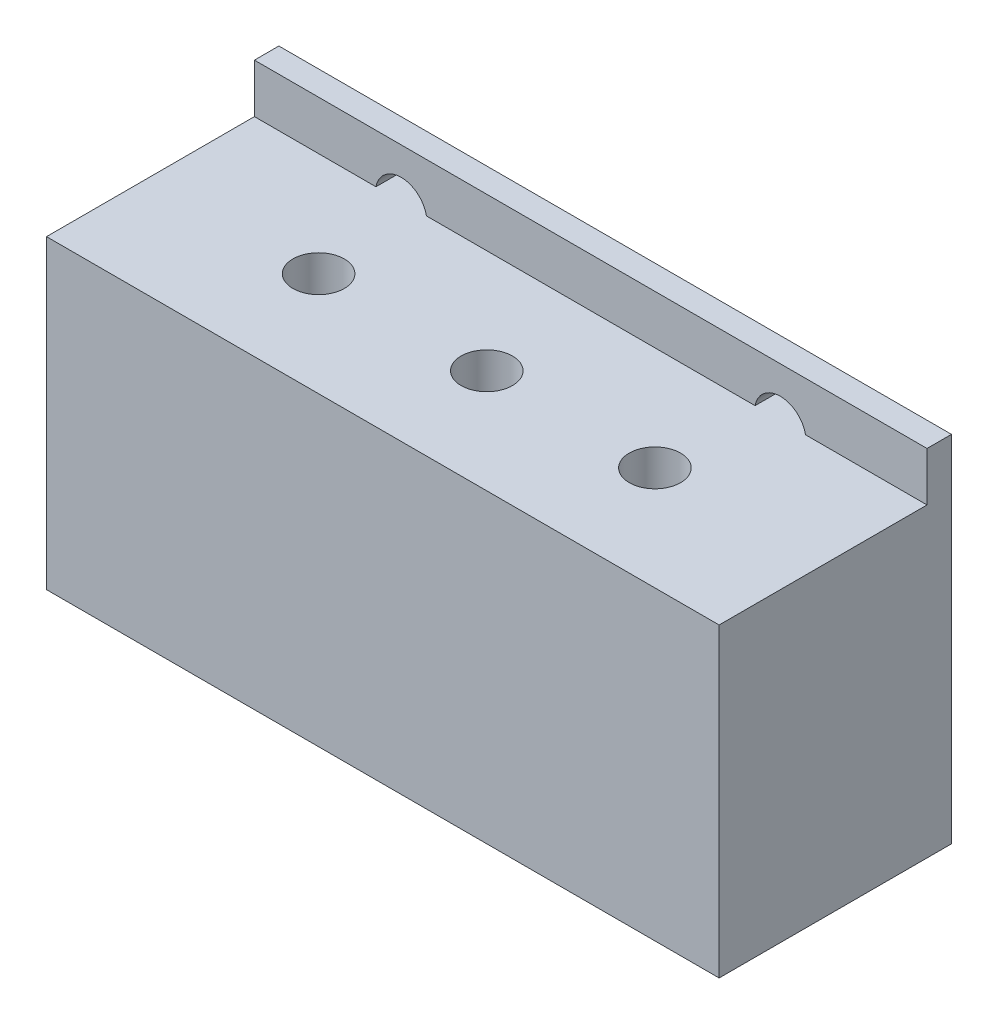
ISO-10303-21;
HEADER;
FILE_DESCRIPTION(('STEP AP214'),'2;1');
FILE_NAME('part.step','',(''),(''),'','','');
FILE_SCHEMA(('AUTOMOTIVE_DESIGN { 1 0 10303 214 1 1 1 1 }'));
ENDSEC;
DATA;
#1=APPLICATION_CONTEXT('core data for automotive mechanical design processes');
#2=APPLICATION_PROTOCOL_DEFINITION('international standard','automotive_design',2000,#1);
#3=PRODUCT_CONTEXT('',#1,'mechanical');
#4=PRODUCT('Part','Part','',(#3));
#5=PRODUCT_RELATED_PRODUCT_CATEGORY('part','',(#4));
#6=PRODUCT_DEFINITION_FORMATION('','',#4);
#7=PRODUCT_DEFINITION_CONTEXT('part definition',#1,'design');
#8=PRODUCT_DEFINITION('design','',#6,#7);
#9=PRODUCT_DEFINITION_SHAPE('','',#8);
#10=(LENGTH_UNIT() NAMED_UNIT(*) SI_UNIT(.MILLI.,.METRE.));
#11=(NAMED_UNIT(*) PLANE_ANGLE_UNIT() SI_UNIT($,.RADIAN.));
#12=(NAMED_UNIT(*) SI_UNIT($,.STERADIAN.) SOLID_ANGLE_UNIT());
#13=UNCERTAINTY_MEASURE_WITH_UNIT(LENGTH_MEASURE(1.E-05),#10,'distance_accuracy_value','');
#14=(GEOMETRIC_REPRESENTATION_CONTEXT(3) GLOBAL_UNCERTAINTY_ASSIGNED_CONTEXT((#13)) GLOBAL_UNIT_ASSIGNED_CONTEXT((#10,
#11,#12)) REPRESENTATION_CONTEXT('',''));
#15=CARTESIAN_POINT('',(0.,0.,0.));
#16=DIRECTION('',(0.,0.,1.));
#17=DIRECTION('',(1.,0.,0.));
#18=AXIS2_PLACEMENT_3D('',#15,#16,#17);
#19=CARTESIAN_POINT('',(0.,0.,10.));
#20=DIRECTION('',(0.,0.,-1.));
#21=DIRECTION('',(-1.,0.,0.));
#22=AXIS2_PLACEMENT_3D('',#19,#20,#21);
#23=PLANE('',#22);
#24=DIRECTION('',(-1.,0.,0.));
#25=VECTOR('',#24,1.);
#26=CARTESIAN_POINT('',(0.,125.,10.));
#27=LINE('',#26,#25);
#28=CARTESIAN_POINT('',(275.,125.,10.));
#29=VERTEX_POINT('',#28);
#30=CARTESIAN_POINT('',(225.307764064044,125.,10.));
#31=VERTEX_POINT('',#30);
#32=EDGE_CURVE('E48',#29,#31,#27,.T.);
#33=ORIENTED_EDGE('',*,*,#32,.F.);
#34=DIRECTION('',(0.,1.,0.));
#35=VECTOR('',#34,1.);
#36=CARTESIAN_POINT('',(275.,0.,10.));
#37=LINE('',#36,#35);
#38=CARTESIAN_POINT('',(275.,145.,10.));
#39=VERTEX_POINT('',#38);
#40=EDGE_CURVE('E140',#29,#39,#37,.T.);
#41=ORIENTED_EDGE('',*,*,#40,.T.);
#42=DIRECTION('',(-1.,0.,0.));
#43=VECTOR('',#42,1.);
#44=CARTESIAN_POINT('',(0.,145.,10.));
#45=LINE('',#44,#43);
#46=CARTESIAN_POINT('',(0.,145.,10.));
#47=VERTEX_POINT('',#46);
#48=EDGE_CURVE('E57',#39,#47,#45,.T.);
#49=ORIENTED_EDGE('',*,*,#48,.T.);
#50=DIRECTION('',(0.,-1.,0.));
#51=VECTOR('',#50,1.);
#52=CARTESIAN_POINT('',(0.,0.,10.));
#53=LINE('',#52,#51);
#54=CARTESIAN_POINT('',(0.,125.,10.));
#55=VERTEX_POINT('',#54);
#56=EDGE_CURVE('E86',#47,#55,#53,.T.);
#57=ORIENTED_EDGE('',*,*,#56,.T.);
#58=CARTESIAN_POINT('',(49.6922359359558,125.,10.));
#59=VERTEX_POINT('',#58);
#60=EDGE_CURVE('E134',#59,#55,#27,.T.);
#61=ORIENTED_EDGE('',*,*,#60,.F.);
#62=CARTESIAN_POINT('',(60.,123.,10.));
#63=DIRECTION('',(0.,0.,1.));
#64=DIRECTION('',(1.,0.,0.));
#65=AXIS2_PLACEMENT_3D('',#62,#63,#64);
#66=CIRCLE('',#65,10.5);
#67=CARTESIAN_POINT('',(70.3077640640442,125.,10.));
#68=VERTEX_POINT('',#67);
#69=EDGE_CURVE('E98',#68,#59,#66,.T.);
#70=ORIENTED_EDGE('',*,*,#69,.F.);
#71=CARTESIAN_POINT('',(204.692235935956,125.,10.));
#72=VERTEX_POINT('',#71);
#73=EDGE_CURVE('E130',#72,#68,#27,.T.);
#74=ORIENTED_EDGE('',*,*,#73,.F.);
#75=CARTESIAN_POINT('',(215.,123.,10.));
#76=DIRECTION('',(0.,0.,1.));
#77=DIRECTION('',(-1.,0.,0.));
#78=AXIS2_PLACEMENT_3D('',#75,#76,#77);
#79=CIRCLE('',#78,10.5);
#80=EDGE_CURVE('E119',#31,#72,#79,.T.);
#81=ORIENTED_EDGE('',*,*,#80,.F.);
#82=EDGE_LOOP('',(#33,#41,#49,#57,#61,#70,#74,#81));
#83=FACE_BOUND('',#82,.T.);
#84=ADVANCED_FACE('F33',(#83),#23,.F.);
#85=CARTESIAN_POINT('',(60.,123.,10.));
#86=DIRECTION('',(0.,0.,-1.));
#87=DIRECTION('',(-1.,0.,0.));
#88=AXIS2_PLACEMENT_3D('',#85,#86,#87);
#89=CYLINDRICAL_SURFACE('',#88,10.5);
#90=ORIENTED_EDGE('',*,*,#69,.T.);
#91=DIRECTION('',(0.,0.,-1.));
#92=VECTOR('',#91,1.);
#93=CARTESIAN_POINT('',(49.6922359359558,125.,10.));
#94=LINE('',#93,#92);
#95=CARTESIAN_POINT('',(49.6922359359558,125.,0.));
#96=VERTEX_POINT('',#95);
#97=EDGE_CURVE('E137',#59,#96,#94,.T.);
#98=ORIENTED_EDGE('',*,*,#97,.T.);
#99=CARTESIAN_POINT('',(60.,123.,0.));
#100=DIRECTION('',(0.,0.,1.));
#101=DIRECTION('',(1.,0.,0.));
#102=AXIS2_PLACEMENT_3D('',#99,#100,#101);
#103=CIRCLE('',#102,10.5);
#104=CARTESIAN_POINT('',(70.3077640640442,125.,0.));
#105=VERTEX_POINT('',#104);
#106=EDGE_CURVE('E102',#105,#96,#103,.T.);
#107=ORIENTED_EDGE('',*,*,#106,.F.);
#108=DIRECTION('',(0.,0.,-1.));
#109=VECTOR('',#108,1.);
#110=CARTESIAN_POINT('',(70.3077640640442,125.,10.));
#111=LINE('',#110,#109);
#112=EDGE_CURVE('E178',#105,#68,#111,.F.);
#113=ORIENTED_EDGE('',*,*,#112,.T.);
#114=EDGE_LOOP('',(#90,#98,#107,#113));
#115=FACE_BOUND('',#114,.T.);
#116=ADVANCED_FACE('F236',(#115),#89,.F.);
#117=CARTESIAN_POINT('',(215.,123.,10.));
#118=DIRECTION('',(0.,0.,-1.));
#119=DIRECTION('',(-1.,0.,0.));
#120=AXIS2_PLACEMENT_3D('',#117,#118,#119);
#121=CYLINDRICAL_SURFACE('',#120,10.5);
#122=ORIENTED_EDGE('',*,*,#80,.T.);
#123=DIRECTION('',(0.,0.,-1.));
#124=VECTOR('',#123,1.);
#125=CARTESIAN_POINT('',(204.692235935956,125.,10.));
#126=LINE('',#125,#124);
#127=CARTESIAN_POINT('',(204.692235935956,125.,0.));
#128=VERTEX_POINT('',#127);
#129=EDGE_CURVE('E11',#72,#128,#126,.T.);
#130=ORIENTED_EDGE('',*,*,#129,.T.);
#131=CARTESIAN_POINT('',(215.,123.,0.));
#132=DIRECTION('',(0.,0.,1.));
#133=DIRECTION('',(-1.,0.,0.));
#134=AXIS2_PLACEMENT_3D('',#131,#132,#133);
#135=CIRCLE('',#134,10.5);
#136=CARTESIAN_POINT('',(225.307764064044,125.,0.));
#137=VERTEX_POINT('',#136);
#138=EDGE_CURVE('E122',#137,#128,#135,.T.);
#139=ORIENTED_EDGE('',*,*,#138,.F.);
#140=DIRECTION('',(0.,0.,-1.));
#141=VECTOR('',#140,1.);
#142=CARTESIAN_POINT('',(225.307764064044,125.,10.));
#143=LINE('',#142,#141);
#144=EDGE_CURVE('E41',#137,#31,#143,.F.);
#145=ORIENTED_EDGE('',*,*,#144,.T.);
#146=EDGE_LOOP('',(#122,#130,#139,#145));
#147=FACE_BOUND('',#146,.T.);
#148=ADVANCED_FACE('F117',(#147),#121,.F.);
#149=CARTESIAN_POINT('',(0.,0.,0.));
#150=DIRECTION('',(0.,0.,-1.));
#151=DIRECTION('',(-1.,0.,0.));
#152=AXIS2_PLACEMENT_3D('',#149,#150,#151);
#153=PLANE('',#152);
#154=DIRECTION('',(-1.,0.,0.));
#155=VECTOR('',#154,1.);
#156=CARTESIAN_POINT('',(275.,125.,0.));
#157=LINE('',#156,#155);
#158=EDGE_CURVE('E197',#137,#128,#157,.T.);
#159=ORIENTED_EDGE('',*,*,#158,.F.);
#160=ORIENTED_EDGE('',*,*,#138,.T.);
#161=EDGE_LOOP('',(#159,#160));
#162=FACE_BOUND('',#161,.T.);
#163=EDGE_CURVE('E167',#105,#96,#157,.T.);
#164=ORIENTED_EDGE('',*,*,#163,.F.);
#165=ORIENTED_EDGE('',*,*,#106,.T.);
#166=EDGE_LOOP('',(#164,#165));
#167=FACE_BOUND('',#166,.T.);
#168=DIRECTION('',(-1.,0.,0.));
#169=VECTOR('',#168,1.);
#170=CARTESIAN_POINT('',(0.,145.,0.));
#171=LINE('',#170,#169);
#172=CARTESIAN_POINT('',(275.,145.,0.));
#173=VERTEX_POINT('',#172);
#174=CARTESIAN_POINT('',(0.,145.,0.));
#175=VERTEX_POINT('',#174);
#176=EDGE_CURVE('E76',#173,#175,#171,.T.);
#177=ORIENTED_EDGE('',*,*,#176,.F.);
#178=DIRECTION('',(0.,1.,0.));
#179=VECTOR('',#178,1.);
#180=CARTESIAN_POINT('',(275.,0.,0.));
#181=LINE('',#180,#179);
#182=CARTESIAN_POINT('',(275.,0.,0.));
#183=VERTEX_POINT('',#182);
#184=EDGE_CURVE('E87',#183,#173,#181,.T.);
#185=ORIENTED_EDGE('',*,*,#184,.F.);
#186=DIRECTION('',(1.,0.,0.));
#187=VECTOR('',#186,1.);
#188=CARTESIAN_POINT('',(0.,0.,0.));
#189=LINE('',#188,#187);
#190=CARTESIAN_POINT('',(0.,0.,0.));
#191=VERTEX_POINT('',#190);
#192=EDGE_CURVE('E96',#191,#183,#189,.T.);
#193=ORIENTED_EDGE('',*,*,#192,.F.);
#194=DIRECTION('',(0.,-1.,0.));
#195=VECTOR('',#194,1.);
#196=CARTESIAN_POINT('',(0.,0.,0.));
#197=LINE('',#196,#195);
#198=EDGE_CURVE('E91',#175,#191,#197,.T.);
#199=ORIENTED_EDGE('',*,*,#198,.F.);
#200=EDGE_LOOP('',(#177,#185,#193,#199));
#201=FACE_BOUND('',#200,.T.);
#202=ADVANCED_FACE('F95',(#162,#167,#201),#153,.T.);
#203=CARTESIAN_POINT('',(0.,0.,10.));
#204=DIRECTION('',(1.,0.,0.));
#205=DIRECTION('',(0.,0.,-1.));
#206=AXIS2_PLACEMENT_3D('',#203,#204,#205);
#207=PLANE('',#206);
#208=DIRECTION('',(0.,0.,-1.));
#209=VECTOR('',#208,1.);
#210=CARTESIAN_POINT('',(0.,0.,10.));
#211=LINE('',#210,#209);
#212=CARTESIAN_POINT('',(0.,0.,95.));
#213=VERTEX_POINT('',#212);
#214=EDGE_CURVE('E112',#213,#191,#211,.T.);
#215=ORIENTED_EDGE('',*,*,#214,.F.);
#216=DIRECTION('',(0.,-1.,0.));
#217=VECTOR('',#216,1.);
#218=CARTESIAN_POINT('',(0.,125.,95.));
#219=LINE('',#218,#217);
#220=CARTESIAN_POINT('',(0.,125.,95.));
#221=VERTEX_POINT('',#220);
#222=EDGE_CURVE('E163',#221,#213,#219,.T.);
#223=ORIENTED_EDGE('',*,*,#222,.F.);
#224=DIRECTION('',(0.,0.,1.));
#225=VECTOR('',#224,1.);
#226=CARTESIAN_POINT('',(0.,125.,0.));
#227=LINE('',#226,#225);
#228=EDGE_CURVE('E193',#55,#221,#227,.T.);
#229=ORIENTED_EDGE('',*,*,#228,.F.);
#230=ORIENTED_EDGE('',*,*,#56,.F.);
#231=DIRECTION('',(0.,0.,-1.));
#232=VECTOR('',#231,1.);
#233=CARTESIAN_POINT('',(0.,145.,10.));
#234=LINE('',#233,#232);
#235=EDGE_CURVE('E79',#47,#175,#234,.T.);
#236=ORIENTED_EDGE('',*,*,#235,.T.);
#237=ORIENTED_EDGE('',*,*,#198,.T.);
#238=EDGE_LOOP('',(#215,#223,#229,#230,#236,#237));
#239=FACE_BOUND('',#238,.T.);
#240=ADVANCED_FACE('F35',(#239),#207,.F.);
#241=CARTESIAN_POINT('',(0.,0.,10.));
#242=DIRECTION('',(0.,1.,0.));
#243=DIRECTION('',(0.,0.,1.));
#244=AXIS2_PLACEMENT_3D('',#241,#242,#243);
#245=PLANE('',#244);
#246=CARTESIAN_POINT('',(206.25,0.,52.5));
#247=DIRECTION('',(0.,1.,0.));
#248=DIRECTION('',(0.,0.,1.));
#249=AXIS2_PLACEMENT_3D('',#246,#247,#248);
#250=CIRCLE('',#249,10.5);
#251=CARTESIAN_POINT('',(206.25,0.,63.));
#252=VERTEX_POINT('',#251);
#253=EDGE_CURVE('E165',#252,#252,#250,.T.);
#254=ORIENTED_EDGE('',*,*,#253,.T.);
#255=EDGE_LOOP('',(#254));
#256=FACE_BOUND('',#255,.T.);
#257=CARTESIAN_POINT('',(137.5,0.,52.5000000000005));
#258=DIRECTION('',(0.,1.,0.));
#259=DIRECTION('',(0.,0.,1.));
#260=AXIS2_PLACEMENT_3D('',#257,#258,#259);
#261=CIRCLE('',#260,10.5);
#262=CARTESIAN_POINT('',(137.5,0.,63.0000000000005));
#263=VERTEX_POINT('',#262);
#264=EDGE_CURVE('E209',#263,#263,#261,.T.);
#265=ORIENTED_EDGE('',*,*,#264,.T.);
#266=EDGE_LOOP('',(#265));
#267=FACE_BOUND('',#266,.T.);
#268=CARTESIAN_POINT('',(68.75,0.,52.500000000001));
#269=DIRECTION('',(0.,1.,0.));
#270=DIRECTION('',(0.,0.,1.));
#271=AXIS2_PLACEMENT_3D('',#268,#269,#270);
#272=CIRCLE('',#271,10.5);
#273=CARTESIAN_POINT('',(68.75,0.,63.000000000001));
#274=VERTEX_POINT('',#273);
#275=EDGE_CURVE('E203',#274,#274,#272,.T.);
#276=ORIENTED_EDGE('',*,*,#275,.T.);
#277=EDGE_LOOP('',(#276));
#278=FACE_BOUND('',#277,.T.);
#279=ORIENTED_EDGE('',*,*,#192,.T.);
#280=DIRECTION('',(0.,0.,-1.));
#281=VECTOR('',#280,1.);
#282=CARTESIAN_POINT('',(275.,0.,10.));
#283=LINE('',#282,#281);
#284=CARTESIAN_POINT('',(275.,0.,95.));
#285=VERTEX_POINT('',#284);
#286=EDGE_CURVE('E109',#285,#183,#283,.T.);
#287=ORIENTED_EDGE('',*,*,#286,.F.);
#288=DIRECTION('',(1.,0.,0.));
#289=VECTOR('',#288,1.);
#290=CARTESIAN_POINT('',(275.,0.,95.));
#291=LINE('',#290,#289);
#292=EDGE_CURVE('E154',#213,#285,#291,.T.);
#293=ORIENTED_EDGE('',*,*,#292,.F.);
#294=ORIENTED_EDGE('',*,*,#214,.T.);
#295=EDGE_LOOP('',(#279,#287,#293,#294));
#296=FACE_BOUND('',#295,.T.);
#297=ADVANCED_FACE('F152',(#256,#267,#278,#296),#245,.F.);
#298=CARTESIAN_POINT('',(275.,0.,10.));
#299=DIRECTION('',(-1.,0.,0.));
#300=DIRECTION('',(0.,0.,1.));
#301=AXIS2_PLACEMENT_3D('',#298,#299,#300);
#302=PLANE('',#301);
#303=ORIENTED_EDGE('',*,*,#184,.T.);
#304=DIRECTION('',(0.,0.,-1.));
#305=VECTOR('',#304,1.);
#306=CARTESIAN_POINT('',(275.,145.,10.));
#307=LINE('',#306,#305);
#308=EDGE_CURVE('E82',#39,#173,#307,.T.);
#309=ORIENTED_EDGE('',*,*,#308,.F.);
#310=ORIENTED_EDGE('',*,*,#40,.F.);
#311=DIRECTION('',(0.,0.,-1.));
#312=VECTOR('',#311,1.);
#313=CARTESIAN_POINT('',(275.,125.,0.));
#314=LINE('',#313,#312);
#315=CARTESIAN_POINT('',(275.,125.,95.));
#316=VERTEX_POINT('',#315);
#317=EDGE_CURVE('E164',#316,#29,#314,.T.);
#318=ORIENTED_EDGE('',*,*,#317,.F.);
#319=DIRECTION('',(0.,-1.,0.));
#320=VECTOR('',#319,1.);
#321=CARTESIAN_POINT('',(275.,125.,95.));
#322=LINE('',#321,#320);
#323=EDGE_CURVE('E148',#316,#285,#322,.T.);
#324=ORIENTED_EDGE('',*,*,#323,.T.);
#325=ORIENTED_EDGE('',*,*,#286,.T.);
#326=EDGE_LOOP('',(#303,#309,#310,#318,#324,#325));
#327=FACE_BOUND('',#326,.T.);
#328=ADVANCED_FACE('F143',(#327),#302,.F.);
#329=CARTESIAN_POINT('',(0.,145.,10.));
#330=DIRECTION('',(0.,-1.,0.));
#331=DIRECTION('',(0.,0.,-1.));
#332=AXIS2_PLACEMENT_3D('',#329,#330,#331);
#333=PLANE('',#332);
#334=ORIENTED_EDGE('',*,*,#176,.T.);
#335=ORIENTED_EDGE('',*,*,#235,.F.);
#336=ORIENTED_EDGE('',*,*,#48,.F.);
#337=ORIENTED_EDGE('',*,*,#308,.T.);
#338=EDGE_LOOP('',(#334,#335,#336,#337));
#339=FACE_BOUND('',#338,.T.);
#340=ADVANCED_FACE('F78',(#339),#333,.F.);
#341=CARTESIAN_POINT('',(275.,125.,95.));
#342=DIRECTION('',(0.,0.,-1.));
#343=DIRECTION('',(-1.,0.,0.));
#344=AXIS2_PLACEMENT_3D('',#341,#342,#343);
#345=PLANE('',#344);
#346=ORIENTED_EDGE('',*,*,#292,.T.);
#347=ORIENTED_EDGE('',*,*,#323,.F.);
#348=DIRECTION('',(1.,0.,0.));
#349=VECTOR('',#348,1.);
#350=CARTESIAN_POINT('',(275.,125.,95.));
#351=LINE('',#350,#349);
#352=EDGE_CURVE('E174',#221,#316,#351,.T.);
#353=ORIENTED_EDGE('',*,*,#352,.F.);
#354=ORIENTED_EDGE('',*,*,#222,.T.);
#355=EDGE_LOOP('',(#346,#347,#353,#354));
#356=FACE_BOUND('',#355,.T.);
#357=ADVANCED_FACE('F159',(#356),#345,.F.);
#358=CARTESIAN_POINT('',(0.,125.,0.));
#359=DIRECTION('',(0.,-1.,0.));
#360=DIRECTION('',(0.,0.,-1.));
#361=AXIS2_PLACEMENT_3D('',#358,#359,#360);
#362=PLANE('',#361);
#363=CARTESIAN_POINT('',(206.25,125.,52.5));
#364=DIRECTION('',(0.,1.,0.));
#365=DIRECTION('',(0.,0.,1.));
#366=AXIS2_PLACEMENT_3D('',#363,#364,#365);
#367=CIRCLE('',#366,10.5);
#368=CARTESIAN_POINT('',(206.25,125.,63.));
#369=VERTEX_POINT('',#368);
#370=EDGE_CURVE('E170',#369,#369,#367,.T.);
#371=ORIENTED_EDGE('',*,*,#370,.F.);
#372=EDGE_LOOP('',(#371));
#373=FACE_BOUND('',#372,.T.);
#374=CARTESIAN_POINT('',(137.5,125.,52.5000000000005));
#375=DIRECTION('',(0.,1.,0.));
#376=DIRECTION('',(0.,0.,1.));
#377=AXIS2_PLACEMENT_3D('',#374,#375,#376);
#378=CIRCLE('',#377,10.5);
#379=CARTESIAN_POINT('',(137.5,125.,63.0000000000005));
#380=VERTEX_POINT('',#379);
#381=EDGE_CURVE('E206',#380,#380,#378,.T.);
#382=ORIENTED_EDGE('',*,*,#381,.F.);
#383=EDGE_LOOP('',(#382));
#384=FACE_BOUND('',#383,.T.);
#385=CARTESIAN_POINT('',(68.75,125.,52.500000000001));
#386=DIRECTION('',(0.,1.,0.));
#387=DIRECTION('',(0.,0.,1.));
#388=AXIS2_PLACEMENT_3D('',#385,#386,#387);
#389=CIRCLE('',#388,10.5);
#390=CARTESIAN_POINT('',(68.75,125.,63.000000000001));
#391=VERTEX_POINT('',#390);
#392=EDGE_CURVE('E200',#391,#391,#389,.T.);
#393=ORIENTED_EDGE('',*,*,#392,.F.);
#394=EDGE_LOOP('',(#393));
#395=FACE_BOUND('',#394,.T.);
#396=ORIENTED_EDGE('',*,*,#97,.F.);
#397=ORIENTED_EDGE('',*,*,#60,.T.);
#398=ORIENTED_EDGE('',*,*,#228,.T.);
#399=ORIENTED_EDGE('',*,*,#352,.T.);
#400=ORIENTED_EDGE('',*,*,#317,.T.);
#401=ORIENTED_EDGE('',*,*,#32,.T.);
#402=ORIENTED_EDGE('',*,*,#144,.F.);
#403=ORIENTED_EDGE('',*,*,#158,.T.);
#404=ORIENTED_EDGE('',*,*,#129,.F.);
#405=ORIENTED_EDGE('',*,*,#73,.T.);
#406=ORIENTED_EDGE('',*,*,#112,.F.);
#407=ORIENTED_EDGE('',*,*,#163,.T.);
#408=EDGE_LOOP('',(#396,#397,#398,#399,#400,#401,#402,#403,#404,#405,#406,#407));
#409=FACE_BOUND('',#408,.T.);
#410=ADVANCED_FACE('F191',(#373,#384,#395,#409),#362,.F.);
#411=CARTESIAN_POINT('',(68.75,0.,52.500000000001));
#412=DIRECTION('',(0.,1.,0.));
#413=DIRECTION('',(0.,0.,1.));
#414=AXIS2_PLACEMENT_3D('',#411,#412,#413);
#415=CYLINDRICAL_SURFACE('',#414,10.5);
#416=ORIENTED_EDGE('',*,*,#275,.F.);
#417=EDGE_LOOP('',(#416));
#418=FACE_BOUND('',#417,.T.);
#419=ORIENTED_EDGE('',*,*,#392,.T.);
#420=EDGE_LOOP('',(#419));
#421=FACE_BOUND('',#420,.T.);
#422=ADVANCED_FACE('F219',(#418,#421),#415,.F.);
#423=CARTESIAN_POINT('',(137.5,0.,52.5000000000005));
#424=DIRECTION('',(0.,1.,0.));
#425=DIRECTION('',(0.,0.,1.));
#426=AXIS2_PLACEMENT_3D('',#423,#424,#425);
#427=CYLINDRICAL_SURFACE('',#426,10.5);
#428=ORIENTED_EDGE('',*,*,#264,.F.);
#429=EDGE_LOOP('',(#428));
#430=FACE_BOUND('',#429,.T.);
#431=ORIENTED_EDGE('',*,*,#381,.T.);
#432=EDGE_LOOP('',(#431));
#433=FACE_BOUND('',#432,.T.);
#434=ADVANCED_FACE('F226',(#430,#433),#427,.F.);
#435=CARTESIAN_POINT('',(206.25,0.,52.5));
#436=DIRECTION('',(0.,1.,0.));
#437=DIRECTION('',(0.,0.,1.));
#438=AXIS2_PLACEMENT_3D('',#435,#436,#437);
#439=CYLINDRICAL_SURFACE('',#438,10.5);
#440=ORIENTED_EDGE('',*,*,#253,.F.);
#441=EDGE_LOOP('',(#440));
#442=FACE_BOUND('',#441,.T.);
#443=ORIENTED_EDGE('',*,*,#370,.T.);
#444=EDGE_LOOP('',(#443));
#445=FACE_BOUND('',#444,.T.);
#446=ADVANCED_FACE('F215',(#442,#445),#439,.F.);
#447=CLOSED_SHELL('',(#84,#116,#148,#202,#240,#297,#328,#340,#357,#410,#422,#434,#446));
#448=MANIFOLD_SOLID_BREP('B2',#447);
#449=ADVANCED_BREP_SHAPE_REPRESENTATION('',(#18,#448),#14);
#450=SHAPE_DEFINITION_REPRESENTATION(#9,#449);
ENDSEC;
END-ISO-10303-21;
